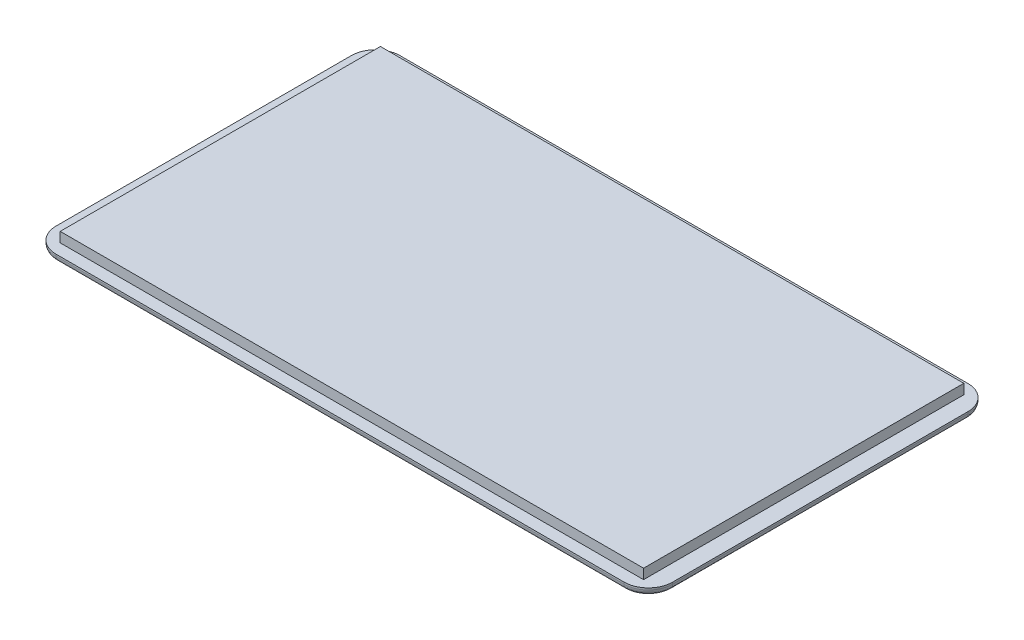
ISO-10303-21;
HEADER;
FILE_DESCRIPTION(('STEP AP214'),'2;1');
FILE_NAME('part.step','',(''),(''),'','','');
FILE_SCHEMA(('AUTOMOTIVE_DESIGN { 1 0 10303 214 1 1 1 1 }'));
ENDSEC;
DATA;
#1=APPLICATION_CONTEXT('core data for automotive mechanical design processes');
#2=APPLICATION_PROTOCOL_DEFINITION('international standard','automotive_design',2000,#1);
#3=PRODUCT_CONTEXT('',#1,'mechanical');
#4=PRODUCT('Part','Part','',(#3));
#5=PRODUCT_RELATED_PRODUCT_CATEGORY('part','',(#4));
#6=PRODUCT_DEFINITION_FORMATION('','',#4);
#7=PRODUCT_DEFINITION_CONTEXT('part definition',#1,'design');
#8=PRODUCT_DEFINITION('design','',#6,#7);
#9=PRODUCT_DEFINITION_SHAPE('','',#8);
#10=(LENGTH_UNIT() NAMED_UNIT(*) SI_UNIT(.MILLI.,.METRE.));
#11=(NAMED_UNIT(*) PLANE_ANGLE_UNIT() SI_UNIT($,.RADIAN.));
#12=(NAMED_UNIT(*) SI_UNIT($,.STERADIAN.) SOLID_ANGLE_UNIT());
#13=UNCERTAINTY_MEASURE_WITH_UNIT(LENGTH_MEASURE(1.E-05),#10,'distance_accuracy_value','');
#14=(GEOMETRIC_REPRESENTATION_CONTEXT(3) GLOBAL_UNCERTAINTY_ASSIGNED_CONTEXT((#13)) GLOBAL_UNIT_ASSIGNED_CONTEXT((#10,
#11,#12)) REPRESENTATION_CONTEXT('',''));
#15=CARTESIAN_POINT('',(0.,0.,0.));
#16=DIRECTION('',(0.,0.,1.));
#17=DIRECTION('',(1.,0.,0.));
#18=AXIS2_PLACEMENT_3D('',#15,#16,#17);
#19=CARTESIAN_POINT('',(48.,3.04,-26.35));
#20=DIRECTION('',(-1.,0.,0.));
#21=DIRECTION('',(0.,0.,1.));
#22=AXIS2_PLACEMENT_3D('',#19,#20,#21);
#23=PLANE('',#22);
#24=DIRECTION('',(0.,0.,-1.));
#25=VECTOR('',#24,1.);
#26=CARTESIAN_POINT('',(48.,1.4,26.35));
#27=LINE('',#26,#25);
#28=CARTESIAN_POINT('',(48.,1.4,26.35));
#29=VERTEX_POINT('',#28);
#30=CARTESIAN_POINT('',(48.,1.4,-26.35));
#31=VERTEX_POINT('',#30);
#32=EDGE_CURVE('E10',#29,#31,#27,.T.);
#33=ORIENTED_EDGE('',*,*,#32,.T.);
#34=DIRECTION('',(0.,-1.,0.));
#35=VECTOR('',#34,1.);
#36=CARTESIAN_POINT('',(48.,3.04,-26.35));
#37=LINE('',#36,#35);
#38=CARTESIAN_POINT('',(48.,3.04,-26.35));
#39=VERTEX_POINT('',#38);
#40=EDGE_CURVE('E24',#39,#31,#37,.T.);
#41=ORIENTED_EDGE('',*,*,#40,.F.);
#42=DIRECTION('',(0.,0.,-1.));
#43=VECTOR('',#42,1.);
#44=CARTESIAN_POINT('',(48.,3.04,26.35));
#45=LINE('',#44,#43);
#46=CARTESIAN_POINT('',(48.,3.04,26.35));
#47=VERTEX_POINT('',#46);
#48=EDGE_CURVE('E291',#47,#39,#45,.T.);
#49=ORIENTED_EDGE('',*,*,#48,.F.);
#50=DIRECTION('',(0.,-1.,0.));
#51=VECTOR('',#50,1.);
#52=CARTESIAN_POINT('',(48.,3.04,26.35));
#53=LINE('',#52,#51);
#54=EDGE_CURVE('E246',#47,#29,#53,.T.);
#55=ORIENTED_EDGE('',*,*,#54,.T.);
#56=EDGE_LOOP('',(#33,#41,#49,#55));
#57=FACE_BOUND('',#56,.T.);
#58=ADVANCED_FACE('F16',(#57),#23,.F.);
#59=CARTESIAN_POINT('',(-48.,3.04,26.35));
#60=DIRECTION('',(0.,0.,-1.));
#61=DIRECTION('',(-1.,0.,0.));
#62=AXIS2_PLACEMENT_3D('',#59,#60,#61);
#63=PLANE('',#62);
#64=DIRECTION('',(1.,0.,0.));
#65=VECTOR('',#64,1.);
#66=CARTESIAN_POINT('',(-48.,1.4,26.35));
#67=LINE('',#66,#65);
#68=CARTESIAN_POINT('',(-48.,1.4,26.35));
#69=VERTEX_POINT('',#68);
#70=EDGE_CURVE('E245',#69,#29,#67,.T.);
#71=ORIENTED_EDGE('',*,*,#70,.T.);
#72=ORIENTED_EDGE('',*,*,#54,.F.);
#73=DIRECTION('',(1.,0.,0.));
#74=VECTOR('',#73,1.);
#75=CARTESIAN_POINT('',(-48.,3.04,26.35));
#76=LINE('',#75,#74);
#77=CARTESIAN_POINT('',(-48.,3.04,26.35));
#78=VERTEX_POINT('',#77);
#79=EDGE_CURVE('E252',#78,#47,#76,.T.);
#80=ORIENTED_EDGE('',*,*,#79,.F.);
#81=DIRECTION('',(0.,-1.,0.));
#82=VECTOR('',#81,1.);
#83=CARTESIAN_POINT('',(-48.,3.04,26.35));
#84=LINE('',#83,#82);
#85=EDGE_CURVE('E248',#78,#69,#84,.T.);
#86=ORIENTED_EDGE('',*,*,#85,.T.);
#87=EDGE_LOOP('',(#71,#72,#80,#86));
#88=FACE_BOUND('',#87,.T.);
#89=ADVANCED_FACE('F234',(#88),#63,.F.);
#90=CARTESIAN_POINT('',(-48.,3.04,-26.35));
#91=DIRECTION('',(1.,0.,0.));
#92=DIRECTION('',(0.,0.,-1.));
#93=AXIS2_PLACEMENT_3D('',#90,#91,#92);
#94=PLANE('',#93);
#95=DIRECTION('',(0.,0.,1.));
#96=VECTOR('',#95,1.);
#97=CARTESIAN_POINT('',(-48.,1.4,-26.35));
#98=LINE('',#97,#96);
#99=CARTESIAN_POINT('',(-48.,1.4,-26.35));
#100=VERTEX_POINT('',#99);
#101=EDGE_CURVE('E257',#100,#69,#98,.T.);
#102=ORIENTED_EDGE('',*,*,#101,.T.);
#103=ORIENTED_EDGE('',*,*,#85,.F.);
#104=DIRECTION('',(0.,0.,1.));
#105=VECTOR('',#104,1.);
#106=CARTESIAN_POINT('',(-48.,3.04,-26.35));
#107=LINE('',#106,#105);
#108=CARTESIAN_POINT('',(-48.,3.04,-26.35));
#109=VERTEX_POINT('',#108);
#110=EDGE_CURVE('E262',#109,#78,#107,.T.);
#111=ORIENTED_EDGE('',*,*,#110,.F.);
#112=DIRECTION('',(0.,-1.,0.));
#113=VECTOR('',#112,1.);
#114=CARTESIAN_POINT('',(-48.,3.04,-26.35));
#115=LINE('',#114,#113);
#116=EDGE_CURVE('E259',#109,#100,#115,.T.);
#117=ORIENTED_EDGE('',*,*,#116,.T.);
#118=EDGE_LOOP('',(#102,#103,#111,#117));
#119=FACE_BOUND('',#118,.T.);
#120=ADVANCED_FACE('F231',(#119),#94,.F.);
#121=CARTESIAN_POINT('',(-48.,3.04,-26.35));
#122=DIRECTION('',(0.,0.,1.));
#123=DIRECTION('',(1.,0.,0.));
#124=AXIS2_PLACEMENT_3D('',#121,#122,#123);
#125=PLANE('',#124);
#126=DIRECTION('',(-1.,0.,0.));
#127=VECTOR('',#126,1.);
#128=CARTESIAN_POINT('',(48.,1.4,-26.35));
#129=LINE('',#128,#127);
#130=EDGE_CURVE('E256',#31,#100,#129,.T.);
#131=ORIENTED_EDGE('',*,*,#130,.T.);
#132=ORIENTED_EDGE('',*,*,#116,.F.);
#133=DIRECTION('',(-1.,0.,0.));
#134=VECTOR('',#133,1.);
#135=CARTESIAN_POINT('',(48.,3.04,-26.35));
#136=LINE('',#135,#134);
#137=EDGE_CURVE('E260',#39,#109,#136,.T.);
#138=ORIENTED_EDGE('',*,*,#137,.F.);
#139=ORIENTED_EDGE('',*,*,#40,.T.);
#140=EDGE_LOOP('',(#131,#132,#138,#139));
#141=FACE_BOUND('',#140,.T.);
#142=ADVANCED_FACE('F227',(#141),#125,.F.);
#143=CARTESIAN_POINT('',(0.,3.04,0.));
#144=DIRECTION('',(0.,1.,0.));
#145=DIRECTION('',(0.,0.,1.));
#146=AXIS2_PLACEMENT_3D('',#143,#144,#145);
#147=PLANE('',#146);
#148=ORIENTED_EDGE('',*,*,#48,.T.);
#149=ORIENTED_EDGE('',*,*,#137,.T.);
#150=ORIENTED_EDGE('',*,*,#110,.T.);
#151=ORIENTED_EDGE('',*,*,#79,.T.);
#152=EDGE_LOOP('',(#148,#149,#150,#151));
#153=FACE_BOUND('',#152,.T.);
#154=ADVANCED_FACE('F223',(#153),#147,.T.);
#155=CARTESIAN_POINT('',(-46.74,1.4,-24.3));
#156=DIRECTION('',(0.,-1.,0.));
#157=DIRECTION('',(0.,0.,-1.));
#158=AXIS2_PLACEMENT_3D('',#155,#156,#157);
#159=PLANE('',#158);
#160=CARTESIAN_POINT('',(-46.74,1.4,-24.3));
#161=DIRECTION('',(0.,-1.,0.));
#162=DIRECTION('',(0.,0.,-1.));
#163=AXIS2_PLACEMENT_3D('',#160,#161,#162);
#164=CIRCLE('',#163,4.);
#165=CARTESIAN_POINT('',(-50.74,1.4,-24.3));
#166=VERTEX_POINT('',#165);
#167=CARTESIAN_POINT('',(-46.74,1.4,-28.3));
#168=VERTEX_POINT('',#167);
#169=EDGE_CURVE('E265',#166,#168,#164,.T.);
#170=ORIENTED_EDGE('',*,*,#169,.F.);
#171=DIRECTION('',(0.,0.,-1.));
#172=VECTOR('',#171,1.);
#173=CARTESIAN_POINT('',(-50.74,1.4,24.3));
#174=LINE('',#173,#172);
#175=CARTESIAN_POINT('',(-50.74,1.4,24.3));
#176=VERTEX_POINT('',#175);
#177=EDGE_CURVE('E305',#176,#166,#174,.T.);
#178=ORIENTED_EDGE('',*,*,#177,.F.);
#179=CARTESIAN_POINT('',(-46.74,1.4,24.3));
#180=DIRECTION('',(0.,-1.,0.));
#181=DIRECTION('',(0.,0.,-1.));
#182=AXIS2_PLACEMENT_3D('',#179,#180,#181);
#183=CIRCLE('',#182,4.);
#184=CARTESIAN_POINT('',(-46.74,1.4,28.3));
#185=VERTEX_POINT('',#184);
#186=EDGE_CURVE('E310',#185,#176,#183,.T.);
#187=ORIENTED_EDGE('',*,*,#186,.F.);
#188=DIRECTION('',(-1.,0.,0.));
#189=VECTOR('',#188,1.);
#190=CARTESIAN_POINT('',(46.74,1.4,28.3));
#191=LINE('',#190,#189);
#192=CARTESIAN_POINT('',(46.74,1.4,28.3));
#193=VERTEX_POINT('',#192);
#194=EDGE_CURVE('E315',#193,#185,#191,.T.);
#195=ORIENTED_EDGE('',*,*,#194,.F.);
#196=CARTESIAN_POINT('',(46.74,1.4,24.3));
#197=DIRECTION('',(0.,-1.,0.));
#198=DIRECTION('',(0.,0.,1.));
#199=AXIS2_PLACEMENT_3D('',#196,#197,#198);
#200=CIRCLE('',#199,4.);
#201=CARTESIAN_POINT('',(50.74,1.4,24.3));
#202=VERTEX_POINT('',#201);
#203=EDGE_CURVE('E320',#202,#193,#200,.T.);
#204=ORIENTED_EDGE('',*,*,#203,.F.);
#205=DIRECTION('',(0.,0.,1.));
#206=VECTOR('',#205,1.);
#207=CARTESIAN_POINT('',(50.74,1.4,-24.3));
#208=LINE('',#207,#206);
#209=CARTESIAN_POINT('',(50.74,1.4,-24.3));
#210=VERTEX_POINT('',#209);
#211=EDGE_CURVE('E325',#210,#202,#208,.T.);
#212=ORIENTED_EDGE('',*,*,#211,.F.);
#213=CARTESIAN_POINT('',(46.74,1.4,-24.3));
#214=DIRECTION('',(0.,-1.,0.));
#215=DIRECTION('',(0.,0.,-1.));
#216=AXIS2_PLACEMENT_3D('',#213,#214,#215);
#217=CIRCLE('',#216,4.);
#218=CARTESIAN_POINT('',(46.74,1.4,-28.3));
#219=VERTEX_POINT('',#218);
#220=EDGE_CURVE('E330',#219,#210,#217,.T.);
#221=ORIENTED_EDGE('',*,*,#220,.F.);
#222=DIRECTION('',(1.,0.,0.));
#223=VECTOR('',#222,1.);
#224=CARTESIAN_POINT('',(-46.74,1.4,-28.3));
#225=LINE('',#224,#223);
#226=EDGE_CURVE('E335',#168,#219,#225,.T.);
#227=ORIENTED_EDGE('',*,*,#226,.F.);
#228=EDGE_LOOP('',(#170,#178,#187,#195,#204,#212,#221,#227));
#229=FACE_BOUND('',#228,.T.);
#230=ORIENTED_EDGE('',*,*,#32,.F.);
#231=ORIENTED_EDGE('',*,*,#70,.F.);
#232=ORIENTED_EDGE('',*,*,#101,.F.);
#233=ORIENTED_EDGE('',*,*,#130,.F.);
#234=EDGE_LOOP('',(#230,#231,#232,#233));
#235=FACE_BOUND('',#234,.T.);
#236=ADVANCED_FACE('F219',(#229,#235),#159,.F.);
#237=CARTESIAN_POINT('',(-46.74,0.1,-28.3));
#238=DIRECTION('',(0.,0.,1.));
#239=DIRECTION('',(1.,0.,0.));
#240=AXIS2_PLACEMENT_3D('',#237,#238,#239);
#241=PLANE('',#240);
#242=DIRECTION('',(0.,1.,0.));
#243=VECTOR('',#242,1.);
#244=CARTESIAN_POINT('',(46.74,1.1,-28.3));
#245=LINE('',#244,#243);
#246=CARTESIAN_POINT('',(46.74,1.1,-28.3));
#247=VERTEX_POINT('',#246);
#248=EDGE_CURVE('E340',#247,#219,#245,.T.);
#249=ORIENTED_EDGE('',*,*,#248,.F.);
#250=DIRECTION('',(1.,0.,0.));
#251=VECTOR('',#250,1.);
#252=CARTESIAN_POINT('',(-46.74,1.1,-28.3));
#253=LINE('',#252,#251);
#254=CARTESIAN_POINT('',(-46.74,1.1,-28.3));
#255=VERTEX_POINT('',#254);
#256=EDGE_CURVE('E345',#255,#247,#253,.T.);
#257=ORIENTED_EDGE('',*,*,#256,.F.);
#258=DIRECTION('',(0.,1.,0.));
#259=VECTOR('',#258,1.);
#260=CARTESIAN_POINT('',(-46.74,1.1,-28.3));
#261=LINE('',#260,#259);
#262=EDGE_CURVE('E350',#255,#168,#261,.T.);
#263=ORIENTED_EDGE('',*,*,#262,.T.);
#264=ORIENTED_EDGE('',*,*,#226,.T.);
#265=EDGE_LOOP('',(#249,#257,#263,#264));
#266=FACE_BOUND('',#265,.T.);
#267=ADVANCED_FACE('F215',(#266),#241,.F.);
#268=CARTESIAN_POINT('',(-46.74,0.1,-24.3));
#269=DIRECTION('',(0.,1.,0.));
#270=DIRECTION('',(0.707106781186548,0.,0.707106781186548));
#271=AXIS2_PLACEMENT_3D('',#268,#269,#270);
#272=CYLINDRICAL_SURFACE('',#271,4.);
#273=ORIENTED_EDGE('',*,*,#262,.F.);
#274=CARTESIAN_POINT('',(-46.74,1.1,-24.3));
#275=DIRECTION('',(0.,-1.,0.));
#276=DIRECTION('',(0.,0.,-1.));
#277=AXIS2_PLACEMENT_3D('',#274,#275,#276);
#278=CIRCLE('',#277,4.);
#279=CARTESIAN_POINT('',(-50.74,1.1,-24.3));
#280=VERTEX_POINT('',#279);
#281=EDGE_CURVE('E355',#280,#255,#278,.T.);
#282=ORIENTED_EDGE('',*,*,#281,.F.);
#283=DIRECTION('',(0.,1.,0.));
#284=VECTOR('',#283,1.);
#285=CARTESIAN_POINT('',(-50.74,1.1,-24.3));
#286=LINE('',#285,#284);
#287=EDGE_CURVE('E360',#280,#166,#286,.T.);
#288=ORIENTED_EDGE('',*,*,#287,.T.);
#289=ORIENTED_EDGE('',*,*,#169,.T.);
#290=EDGE_LOOP('',(#273,#282,#288,#289));
#291=FACE_BOUND('',#290,.T.);
#292=ADVANCED_FACE('F211',(#291),#272,.T.);
#293=CARTESIAN_POINT('',(-50.74,0.1,24.3));
#294=DIRECTION('',(1.,0.,0.));
#295=DIRECTION('',(0.,0.,-1.));
#296=AXIS2_PLACEMENT_3D('',#293,#294,#295);
#297=PLANE('',#296);
#298=ORIENTED_EDGE('',*,*,#287,.F.);
#299=DIRECTION('',(0.,0.,-1.));
#300=VECTOR('',#299,1.);
#301=CARTESIAN_POINT('',(-50.74,1.1,24.3));
#302=LINE('',#301,#300);
#303=CARTESIAN_POINT('',(-50.74,1.1,24.3));
#304=VERTEX_POINT('',#303);
#305=EDGE_CURVE('E365',#304,#280,#302,.T.);
#306=ORIENTED_EDGE('',*,*,#305,.F.);
#307=DIRECTION('',(0.,1.,0.));
#308=VECTOR('',#307,1.);
#309=CARTESIAN_POINT('',(-50.74,1.1,24.3));
#310=LINE('',#309,#308);
#311=EDGE_CURVE('E370',#304,#176,#310,.T.);
#312=ORIENTED_EDGE('',*,*,#311,.T.);
#313=ORIENTED_EDGE('',*,*,#177,.T.);
#314=EDGE_LOOP('',(#298,#306,#312,#313));
#315=FACE_BOUND('',#314,.T.);
#316=ADVANCED_FACE('F207',(#315),#297,.F.);
#317=CARTESIAN_POINT('',(-46.74,0.1,24.3));
#318=DIRECTION('',(0.,1.,0.));
#319=DIRECTION('',(0.707106781186548,0.,-0.707106781186547));
#320=AXIS2_PLACEMENT_3D('',#317,#318,#319);
#321=CYLINDRICAL_SURFACE('',#320,4.);
#322=ORIENTED_EDGE('',*,*,#311,.F.);
#323=CARTESIAN_POINT('',(-46.74,1.1,24.3));
#324=DIRECTION('',(0.,-1.,0.));
#325=DIRECTION('',(0.,0.,-1.));
#326=AXIS2_PLACEMENT_3D('',#323,#324,#325);
#327=CIRCLE('',#326,4.);
#328=CARTESIAN_POINT('',(-46.74,1.1,28.3));
#329=VERTEX_POINT('',#328);
#330=EDGE_CURVE('E375',#329,#304,#327,.T.);
#331=ORIENTED_EDGE('',*,*,#330,.F.);
#332=DIRECTION('',(0.,1.,0.));
#333=VECTOR('',#332,1.);
#334=CARTESIAN_POINT('',(-46.74,1.1,28.3));
#335=LINE('',#334,#333);
#336=EDGE_CURVE('E380',#329,#185,#335,.T.);
#337=ORIENTED_EDGE('',*,*,#336,.T.);
#338=ORIENTED_EDGE('',*,*,#186,.T.);
#339=EDGE_LOOP('',(#322,#331,#337,#338));
#340=FACE_BOUND('',#339,.T.);
#341=ADVANCED_FACE('F203',(#340),#321,.T.);
#342=CARTESIAN_POINT('',(-46.74,0.1,28.3));
#343=DIRECTION('',(0.,0.,-1.));
#344=DIRECTION('',(-1.,0.,0.));
#345=AXIS2_PLACEMENT_3D('',#342,#343,#344);
#346=PLANE('',#345);
#347=ORIENTED_EDGE('',*,*,#336,.F.);
#348=DIRECTION('',(-1.,0.,0.));
#349=VECTOR('',#348,1.);
#350=CARTESIAN_POINT('',(46.74,1.1,28.3));
#351=LINE('',#350,#349);
#352=CARTESIAN_POINT('',(46.74,1.1,28.3));
#353=VERTEX_POINT('',#352);
#354=EDGE_CURVE('E385',#353,#329,#351,.T.);
#355=ORIENTED_EDGE('',*,*,#354,.F.);
#356=DIRECTION('',(0.,1.,0.));
#357=VECTOR('',#356,1.);
#358=CARTESIAN_POINT('',(46.74,1.1,28.3));
#359=LINE('',#358,#357);
#360=EDGE_CURVE('E389',#353,#193,#359,.T.);
#361=ORIENTED_EDGE('',*,*,#360,.T.);
#362=ORIENTED_EDGE('',*,*,#194,.T.);
#363=EDGE_LOOP('',(#347,#355,#361,#362));
#364=FACE_BOUND('',#363,.T.);
#365=ADVANCED_FACE('F199',(#364),#346,.F.);
#366=CARTESIAN_POINT('',(46.74,0.1,24.3));
#367=DIRECTION('',(0.,1.,0.));
#368=DIRECTION('',(-0.707106781186548,0.,-0.707106781186547));
#369=AXIS2_PLACEMENT_3D('',#366,#367,#368);
#370=CYLINDRICAL_SURFACE('',#369,4.);
#371=ORIENTED_EDGE('',*,*,#360,.F.);
#372=CARTESIAN_POINT('',(46.74,1.1,24.3));
#373=DIRECTION('',(0.,-1.,0.));
#374=DIRECTION('',(0.,0.,-1.));
#375=AXIS2_PLACEMENT_3D('',#372,#373,#374);
#376=CIRCLE('',#375,4.);
#377=CARTESIAN_POINT('',(50.74,1.1,24.3));
#378=VERTEX_POINT('',#377);
#379=EDGE_CURVE('E144',#378,#353,#376,.T.);
#380=ORIENTED_EDGE('',*,*,#379,.F.);
#381=DIRECTION('',(0.,1.,0.));
#382=VECTOR('',#381,1.);
#383=CARTESIAN_POINT('',(50.74,1.1,24.3));
#384=LINE('',#383,#382);
#385=EDGE_CURVE('E397',#378,#202,#384,.T.);
#386=ORIENTED_EDGE('',*,*,#385,.T.);
#387=ORIENTED_EDGE('',*,*,#203,.T.);
#388=EDGE_LOOP('',(#371,#380,#386,#387));
#389=FACE_BOUND('',#388,.T.);
#390=ADVANCED_FACE('F195',(#389),#370,.T.);
#391=CARTESIAN_POINT('',(50.74,0.1,24.3));
#392=DIRECTION('',(-1.,0.,0.));
#393=DIRECTION('',(0.,0.,1.));
#394=AXIS2_PLACEMENT_3D('',#391,#392,#393);
#395=PLANE('',#394);
#396=ORIENTED_EDGE('',*,*,#385,.F.);
#397=DIRECTION('',(0.,0.,1.));
#398=VECTOR('',#397,1.);
#399=CARTESIAN_POINT('',(50.74,1.1,-24.3));
#400=LINE('',#399,#398);
#401=CARTESIAN_POINT('',(50.74,1.1,-24.3));
#402=VERTEX_POINT('',#401);
#403=EDGE_CURVE('E402',#402,#378,#400,.T.);
#404=ORIENTED_EDGE('',*,*,#403,.F.);
#405=DIRECTION('',(0.,1.,0.));
#406=VECTOR('',#405,1.);
#407=CARTESIAN_POINT('',(50.74,1.1,-24.3));
#408=LINE('',#407,#406);
#409=EDGE_CURVE('E407',#402,#210,#408,.T.);
#410=ORIENTED_EDGE('',*,*,#409,.T.);
#411=ORIENTED_EDGE('',*,*,#211,.T.);
#412=EDGE_LOOP('',(#396,#404,#410,#411));
#413=FACE_BOUND('',#412,.T.);
#414=ADVANCED_FACE('F191',(#413),#395,.F.);
#415=CARTESIAN_POINT('',(46.74,0.1,-24.3));
#416=DIRECTION('',(0.,1.,0.));
#417=DIRECTION('',(-0.707106781186548,0.,0.707106781186548));
#418=AXIS2_PLACEMENT_3D('',#415,#416,#417);
#419=CYLINDRICAL_SURFACE('',#418,4.);
#420=ORIENTED_EDGE('',*,*,#409,.F.);
#421=CARTESIAN_POINT('',(46.74,1.1,-24.3));
#422=DIRECTION('',(0.,-1.,0.));
#423=DIRECTION('',(0.,0.,-1.));
#424=AXIS2_PLACEMENT_3D('',#421,#422,#423);
#425=CIRCLE('',#424,4.);
#426=EDGE_CURVE('E412',#247,#402,#425,.T.);
#427=ORIENTED_EDGE('',*,*,#426,.F.);
#428=ORIENTED_EDGE('',*,*,#248,.T.);
#429=ORIENTED_EDGE('',*,*,#220,.T.);
#430=EDGE_LOOP('',(#420,#427,#428,#429));
#431=FACE_BOUND('',#430,.T.);
#432=ADVANCED_FACE('F180',(#431),#419,.T.);
#433=CARTESIAN_POINT('',(46.73999996,1.1,-28.3));
#434=CARTESIAN_POINT('',(46.73999996,0.0999999999999999,-28.3));
#435=CARTESIAN_POINT('',(46.73999997,0.1,-27.3));
#436=CARTESIAN_POINT('',(50.74000004,1.1,-28.30000004));
#437=CARTESIAN_POINT('',(50.74000004,0.0999999999999999,-28.30000004));
#438=CARTESIAN_POINT('',(49.74000003,0.1,-27.30000003));
#439=CARTESIAN_POINT('',(50.74,1.1,-24.29999996));
#440=CARTESIAN_POINT('',(50.74,0.0999999999999999,-24.29999996));
#441=CARTESIAN_POINT('',(49.74,0.1,-24.29999997));
#442=(BOUNDED_SURFACE() B_SPLINE_SURFACE(2,2,((#433,#434,#435),(#436,#437,#438),(#439,#440,
#441)),.UNSPECIFIED.,.F.,.F.,.F.) B_SPLINE_SURFACE_WITH_KNOTS((3,3),(3,3),(0.,1.),(0.,1.),
.UNSPECIFIED.) GEOMETRIC_REPRESENTATION_ITEM() RATIONAL_B_SPLINE_SURFACE(((1.,0.707106781186547,
1.),(0.707106774115478,0.499999994999998,0.707106774115478),(1.,0.707106781186547,1.))) REPRESENTATION_ITEM('') SURFACE());
#443=CARTESIAN_POINT('',(46.74,1.1,-27.3));
#444=DIRECTION('',(-1.,0.,0.));
#445=DIRECTION('',(0.,0.,1.));
#446=AXIS2_PLACEMENT_3D('',#443,#444,#445);
#447=CIRCLE('',#446,1.);
#448=CARTESIAN_POINT('',(46.74,0.1,-27.3));
#449=VERTEX_POINT('',#448);
#450=EDGE_CURVE('E417',#247,#449,#447,.T.);
#451=CARTESIAN_POINT('',(49.74,1.1,-24.3));
#452=DIRECTION('',(0.,0.,1.));
#453=DIRECTION('',(1.,0.,0.));
#454=AXIS2_PLACEMENT_3D('',#451,#452,#453);
#455=CIRCLE('',#454,1.);
#456=CARTESIAN_POINT('',(49.74,0.1,-24.3));
#457=VERTEX_POINT('',#456);
#458=EDGE_CURVE('E156',#457,#402,#455,.T.);
#459=CARTESIAN_POINT('',(49.74,0.1,-24.29999997));
#460=CARTESIAN_POINT('',(49.74000003,0.1,-27.30000003));
#461=CARTESIAN_POINT('',(46.73999997,0.1,-27.3));
#462=(BOUNDED_CURVE() B_SPLINE_CURVE(2,(#459,#460,#461),.UNSPECIFIED.,.F.,
.F.) B_SPLINE_CURVE_WITH_KNOTS((3,3),(0.,1.),
.UNSPECIFIED.) CURVE() GEOMETRIC_REPRESENTATION_ITEM() RATIONAL_B_SPLINE_CURVE((1.,
0.707106774115478,1.)) REPRESENTATION_ITEM(''));
#463=EDGE_CURVE('E153',#449,#457,#462,.F.);
#464=ORIENTED_EDGE('',*,*,#450,.F.);
#465=ORIENTED_EDGE('',*,*,#426,.T.);
#466=ORIENTED_EDGE('',*,*,#458,.F.);
#467=ORIENTED_EDGE('',*,*,#463,.F.);
#468=EDGE_LOOP('',(#464,#465,#466,#467));
#469=FACE_BOUND('',#468,.T.);
#470=ADVANCED_FACE('F168',(#469),#442,.T.);
#471=CARTESIAN_POINT('',(-46.74,0.1,-24.3));
#472=DIRECTION('',(0.,-1.,0.));
#473=DIRECTION('',(0.,0.,-1.));
#474=AXIS2_PLACEMENT_3D('',#471,#472,#473);
#475=PLANE('',#474);
#476=DIRECTION('',(-1.,0.,0.));
#477=VECTOR('',#476,1.);
#478=CARTESIAN_POINT('',(46.74,0.1,27.3));
#479=LINE('',#478,#477);
#480=CARTESIAN_POINT('',(46.74,0.1,27.3));
#481=VERTEX_POINT('',#480);
#482=CARTESIAN_POINT('',(-46.74,0.1,27.3));
#483=VERTEX_POINT('',#482);
#484=EDGE_CURVE('E128',#481,#483,#479,.T.);
#485=ORIENTED_EDGE('',*,*,#484,.T.);
#486=CARTESIAN_POINT('',(-49.74,0.1,24.29999997));
#487=CARTESIAN_POINT('',(-49.74000003,0.1,27.30000003));
#488=CARTESIAN_POINT('',(-46.73999997,0.1,27.3));
#489=(BOUNDED_CURVE() B_SPLINE_CURVE(2,(#486,#487,#488),.UNSPECIFIED.,.F.,
.F.) B_SPLINE_CURVE_WITH_KNOTS((3,3),(0.,1.),
.UNSPECIFIED.) CURVE() GEOMETRIC_REPRESENTATION_ITEM() RATIONAL_B_SPLINE_CURVE((1.,
0.707106774115479,1.)) REPRESENTATION_ITEM(''));
#490=CARTESIAN_POINT('',(-49.74,0.1,24.3));
#491=VERTEX_POINT('',#490);
#492=EDGE_CURVE('E154',#483,#491,#489,.F.);
#493=ORIENTED_EDGE('',*,*,#492,.T.);
#494=DIRECTION('',(0.,0.,-1.));
#495=VECTOR('',#494,1.);
#496=CARTESIAN_POINT('',(-49.74,0.1,24.3));
#497=LINE('',#496,#495);
#498=CARTESIAN_POINT('',(-49.74,0.1,-24.3));
#499=VERTEX_POINT('',#498);
#500=EDGE_CURVE('E157',#491,#499,#497,.T.);
#501=ORIENTED_EDGE('',*,*,#500,.T.);
#502=CARTESIAN_POINT('',(-46.73999997,0.0999999999999999,-27.3));
#503=CARTESIAN_POINT('',(-49.74000003,0.0999999999999999,-27.30000003));
#504=CARTESIAN_POINT('',(-49.74,0.0999999999999999,-24.29999997));
#505=(BOUNDED_CURVE() B_SPLINE_CURVE(2,(#502,#503,#504),.UNSPECIFIED.,.F.,
.F.) B_SPLINE_CURVE_WITH_KNOTS((3,3),(0.,1.),
.UNSPECIFIED.) CURVE() GEOMETRIC_REPRESENTATION_ITEM() RATIONAL_B_SPLINE_CURVE((1.,
0.707106774115479,1.)) REPRESENTATION_ITEM(''));
#506=CARTESIAN_POINT('',(-46.74,0.1,-27.3));
#507=VERTEX_POINT('',#506);
#508=EDGE_CURVE('E498',#499,#507,#505,.F.);
#509=ORIENTED_EDGE('',*,*,#508,.T.);
#510=DIRECTION('',(1.,0.,0.));
#511=VECTOR('',#510,1.);
#512=CARTESIAN_POINT('',(-46.74,0.1,-27.3));
#513=LINE('',#512,#511);
#514=EDGE_CURVE('E695',#507,#449,#513,.T.);
#515=ORIENTED_EDGE('',*,*,#514,.T.);
#516=ORIENTED_EDGE('',*,*,#463,.T.);
#517=DIRECTION('',(0.,0.,1.));
#518=VECTOR('',#517,1.);
#519=CARTESIAN_POINT('',(49.74,0.1,-24.3));
#520=LINE('',#519,#518);
#521=CARTESIAN_POINT('',(49.74,0.1,24.3));
#522=VERTEX_POINT('',#521);
#523=EDGE_CURVE('E132',#457,#522,#520,.T.);
#524=ORIENTED_EDGE('',*,*,#523,.T.);
#525=CARTESIAN_POINT('',(46.73999997,0.0999999999999999,27.3));
#526=CARTESIAN_POINT('',(49.74000003,0.0999999999999999,27.30000003));
#527=CARTESIAN_POINT('',(49.74,0.0999999999999999,24.29999997));
#528=(BOUNDED_CURVE() B_SPLINE_CURVE(2,(#525,#526,#527),.UNSPECIFIED.,.F.,
.F.) B_SPLINE_CURVE_WITH_KNOTS((3,3),(0.,1.),
.UNSPECIFIED.) CURVE() GEOMETRIC_REPRESENTATION_ITEM() RATIONAL_B_SPLINE_CURVE((1.,
0.70710677411548,1.)) REPRESENTATION_ITEM(''));
#529=EDGE_CURVE('E123',#522,#481,#528,.F.);
#530=ORIENTED_EDGE('',*,*,#529,.T.);
#531=EDGE_LOOP('',(#485,#493,#501,#509,#515,#516,#524,#530));
#532=FACE_BOUND('',#531,.T.);
#533=ADVANCED_FACE('F126',(#532),#475,.T.);
#534=CARTESIAN_POINT('',(50.74,1.1,24.29999996));
#535=CARTESIAN_POINT('',(50.74,0.100000000000001,24.29999996));
#536=CARTESIAN_POINT('',(49.74,0.0999999999999999,24.29999997));
#537=CARTESIAN_POINT('',(50.74000004,1.1,28.30000004));
#538=CARTESIAN_POINT('',(50.74000004,0.100000000000001,28.30000004));
#539=CARTESIAN_POINT('',(49.74000003,0.0999999999999999,27.30000003));
#540=CARTESIAN_POINT('',(46.73999996,1.1,28.3));
#541=CARTESIAN_POINT('',(46.73999996,0.100000000000001,28.3));
#542=CARTESIAN_POINT('',(46.73999997,0.0999999999999999,27.3));
#543=(BOUNDED_SURFACE() B_SPLINE_SURFACE(2,2,((#534,#535,#536),(#537,#538,#539),(#540,#541,
#542)),.UNSPECIFIED.,.F.,.F.,.F.) B_SPLINE_SURFACE_WITH_KNOTS((3,3),(3,3),(0.,1.),(0.,1.),
.UNSPECIFIED.) GEOMETRIC_REPRESENTATION_ITEM() RATIONAL_B_SPLINE_SURFACE(((1.,0.707106781186548,
1.),(0.70710677411548,0.499999995000001,0.70710677411548),(1.,0.707106781186548,1.))) REPRESENTATION_ITEM('') SURFACE());
#544=CARTESIAN_POINT('',(49.74,1.1,24.3));
#545=DIRECTION('',(0.,0.,1.));
#546=DIRECTION('',(1.,0.,0.));
#547=AXIS2_PLACEMENT_3D('',#544,#545,#546);
#548=CIRCLE('',#547,1.);
#549=EDGE_CURVE('E137',#522,#378,#548,.T.);
#550=CARTESIAN_POINT('',(46.74,1.1,27.3));
#551=DIRECTION('',(-1.,0.,0.));
#552=DIRECTION('',(0.,0.,1.));
#553=AXIS2_PLACEMENT_3D('',#550,#551,#552);
#554=CIRCLE('',#553,1.);
#555=EDGE_CURVE('E142',#481,#353,#554,.T.);
#556=ORIENTED_EDGE('',*,*,#549,.T.);
#557=ORIENTED_EDGE('',*,*,#379,.T.);
#558=ORIENTED_EDGE('',*,*,#555,.F.);
#559=ORIENTED_EDGE('',*,*,#529,.F.);
#560=EDGE_LOOP('',(#556,#557,#558,#559));
#561=FACE_BOUND('',#560,.T.);
#562=ADVANCED_FACE('F143',(#561),#543,.T.);
#563=CARTESIAN_POINT('',(-46.74000001,1.1,27.3));
#564=DIRECTION('',(1.,0.,0.));
#565=DIRECTION('',(0.,0.707106781186548,-0.707106781186548));
#566=AXIS2_PLACEMENT_3D('',#563,#564,#565);
#567=CYLINDRICAL_SURFACE('',#566,1.);
#568=ORIENTED_EDGE('',*,*,#555,.T.);
#569=ORIENTED_EDGE('',*,*,#354,.T.);
#570=CARTESIAN_POINT('',(-46.74,1.1,27.3));
#571=DIRECTION('',(-1.,0.,0.));
#572=DIRECTION('',(0.,0.,1.));
#573=AXIS2_PLACEMENT_3D('',#570,#571,#572);
#574=CIRCLE('',#573,1.);
#575=EDGE_CURVE('E148',#483,#329,#574,.T.);
#576=ORIENTED_EDGE('',*,*,#575,.F.);
#577=ORIENTED_EDGE('',*,*,#484,.F.);
#578=EDGE_LOOP('',(#568,#569,#576,#577));
#579=FACE_BOUND('',#578,.T.);
#580=ADVANCED_FACE('F150',(#579),#567,.T.);
#581=CARTESIAN_POINT('',(-46.73999996,1.1,28.3));
#582=CARTESIAN_POINT('',(-46.73999996,0.100000000000001,28.3));
#583=CARTESIAN_POINT('',(-46.73999997,0.1,27.3));
#584=CARTESIAN_POINT('',(-50.74000004,1.1,28.30000004));
#585=CARTESIAN_POINT('',(-50.74000004,0.100000000000001,28.30000004));
#586=CARTESIAN_POINT('',(-49.74000003,0.1,27.30000003));
#587=CARTESIAN_POINT('',(-50.74,1.1,24.29999996));
#588=CARTESIAN_POINT('',(-50.74,0.100000000000001,24.29999996));
#589=CARTESIAN_POINT('',(-49.74,0.1,24.29999997));
#590=(BOUNDED_SURFACE() B_SPLINE_SURFACE(2,2,((#581,#582,#583),(#584,#585,#586),(#587,#588,
#589)),.UNSPECIFIED.,.F.,.F.,.F.) B_SPLINE_SURFACE_WITH_KNOTS((3,3),(3,3),(0.,1.),(0.,1.),
.UNSPECIFIED.) GEOMETRIC_REPRESENTATION_ITEM() RATIONAL_B_SPLINE_SURFACE(((1.,0.707106781186547,
1.),(0.707106774115479,0.499999995,0.707106774115479),(1.,0.707106781186547,1.))) REPRESENTATION_ITEM('') SURFACE());
#591=CARTESIAN_POINT('',(-49.74,1.1,24.3));
#592=DIRECTION('',(0.,0.,1.));
#593=DIRECTION('',(0.,-1.,0.));
#594=AXIS2_PLACEMENT_3D('',#591,#592,#593);
#595=CIRCLE('',#594,1.);
#596=EDGE_CURVE('E436',#304,#491,#595,.T.);
#597=ORIENTED_EDGE('',*,*,#575,.T.);
#598=ORIENTED_EDGE('',*,*,#330,.T.);
#599=ORIENTED_EDGE('',*,*,#596,.T.);
#600=ORIENTED_EDGE('',*,*,#492,.F.);
#601=EDGE_LOOP('',(#597,#598,#599,#600));
#602=FACE_BOUND('',#601,.T.);
#603=ADVANCED_FACE('F432',(#602),#590,.T.);
#604=CARTESIAN_POINT('',(-49.74,1.1,-24.30000001));
#605=DIRECTION('',(0.,0.,1.));
#606=DIRECTION('',(0.707106781186548,0.707106781186548,0.));
#607=AXIS2_PLACEMENT_3D('',#604,#605,#606);
#608=CYLINDRICAL_SURFACE('',#607,1.);
#609=CARTESIAN_POINT('',(-49.74,1.1,-24.3));
#610=DIRECTION('',(0.,0.,1.));
#611=DIRECTION('',(1.,0.,0.));
#612=AXIS2_PLACEMENT_3D('',#609,#610,#611);
#613=CIRCLE('',#612,1.);
#614=EDGE_CURVE('E438',#280,#499,#613,.T.);
#615=ORIENTED_EDGE('',*,*,#614,.T.);
#616=ORIENTED_EDGE('',*,*,#500,.F.);
#617=ORIENTED_EDGE('',*,*,#596,.F.);
#618=ORIENTED_EDGE('',*,*,#305,.T.);
#619=EDGE_LOOP('',(#615,#616,#617,#618));
#620=FACE_BOUND('',#619,.T.);
#621=ADVANCED_FACE('F469',(#620),#608,.T.);
#622=CARTESIAN_POINT('',(-50.74,1.1,-24.29999996));
#623=CARTESIAN_POINT('',(-50.74,0.100000000000002,-24.29999996));
#624=CARTESIAN_POINT('',(-49.74,0.0999999999999999,-24.29999997));
#625=CARTESIAN_POINT('',(-50.74000004,1.1,-28.30000004));
#626=CARTESIAN_POINT('',(-50.74000004,0.100000000000002,-28.30000004));
#627=CARTESIAN_POINT('',(-49.74000003,0.0999999999999999,-27.30000003));
#628=CARTESIAN_POINT('',(-46.73999996,1.1,-28.3));
#629=CARTESIAN_POINT('',(-46.73999996,0.100000000000002,-28.3));
#630=CARTESIAN_POINT('',(-46.73999997,0.0999999999999999,-27.3));
#631=(BOUNDED_SURFACE() B_SPLINE_SURFACE(2,2,((#622,#623,#624),(#625,#626,#627),(#628,#629,
#630)),.UNSPECIFIED.,.F.,.F.,.F.) B_SPLINE_SURFACE_WITH_KNOTS((3,3),(3,3),(0.,1.),(0.,1.),
.UNSPECIFIED.) GEOMETRIC_REPRESENTATION_ITEM() RATIONAL_B_SPLINE_SURFACE(((1.,0.707106781186548,
1.),(0.707106774115479,0.499999995,0.707106774115479),(1.,0.707106781186548,1.))) REPRESENTATION_ITEM('') SURFACE());
#632=CARTESIAN_POINT('',(-46.74,1.1,-27.3));
#633=DIRECTION('',(-1.,0.,0.));
#634=DIRECTION('',(0.,0.,1.));
#635=AXIS2_PLACEMENT_3D('',#632,#633,#634);
#636=CIRCLE('',#635,1.);
#637=EDGE_CURVE('E489',#255,#507,#636,.T.);
#638=ORIENTED_EDGE('',*,*,#637,.T.);
#639=ORIENTED_EDGE('',*,*,#508,.F.);
#640=ORIENTED_EDGE('',*,*,#614,.F.);
#641=ORIENTED_EDGE('',*,*,#281,.T.);
#642=EDGE_LOOP('',(#638,#639,#640,#641));
#643=FACE_BOUND('',#642,.T.);
#644=ADVANCED_FACE('F501',(#643),#631,.T.);
#645=CARTESIAN_POINT('',(46.74000001,1.1,-27.3));
#646=DIRECTION('',(-1.,0.,0.));
#647=DIRECTION('',(0.,0.707106781186548,0.707106781186548));
#648=AXIS2_PLACEMENT_3D('',#645,#646,#647);
#649=CYLINDRICAL_SURFACE('',#648,1.);
#650=ORIENTED_EDGE('',*,*,#450,.T.);
#651=ORIENTED_EDGE('',*,*,#514,.F.);
#652=ORIENTED_EDGE('',*,*,#637,.F.);
#653=ORIENTED_EDGE('',*,*,#256,.T.);
#654=EDGE_LOOP('',(#650,#651,#652,#653));
#655=FACE_BOUND('',#654,.T.);
#656=ADVANCED_FACE('F512',(#655),#649,.T.);
#657=CARTESIAN_POINT('',(49.74,1.1,24.30000001));
#658=DIRECTION('',(0.,0.,-1.));
#659=DIRECTION('',(-0.707106781186548,0.707106781186548,0.));
#660=AXIS2_PLACEMENT_3D('',#657,#658,#659);
#661=CYLINDRICAL_SURFACE('',#660,1.);
#662=ORIENTED_EDGE('',*,*,#458,.T.);
#663=ORIENTED_EDGE('',*,*,#403,.T.);
#664=ORIENTED_EDGE('',*,*,#549,.F.);
#665=ORIENTED_EDGE('',*,*,#523,.F.);
#666=EDGE_LOOP('',(#662,#663,#664,#665));
#667=FACE_BOUND('',#666,.T.);
#668=ADVANCED_FACE('F425',(#667),#661,.T.);
#669=CLOSED_SHELL('',(#58,#89,#120,#142,#154,#236,#267,#292,#316,#341,#365,#390,#414,#432,#470,
#533,#562,#580,#603,#621,#644,#656,#668));
#670=MANIFOLD_SOLID_BREP('B1',#669);
#671=ADVANCED_BREP_SHAPE_REPRESENTATION('',(#18,#670),#14);
#672=SHAPE_DEFINITION_REPRESENTATION(#9,#671);
ENDSEC;
END-ISO-10303-21;
